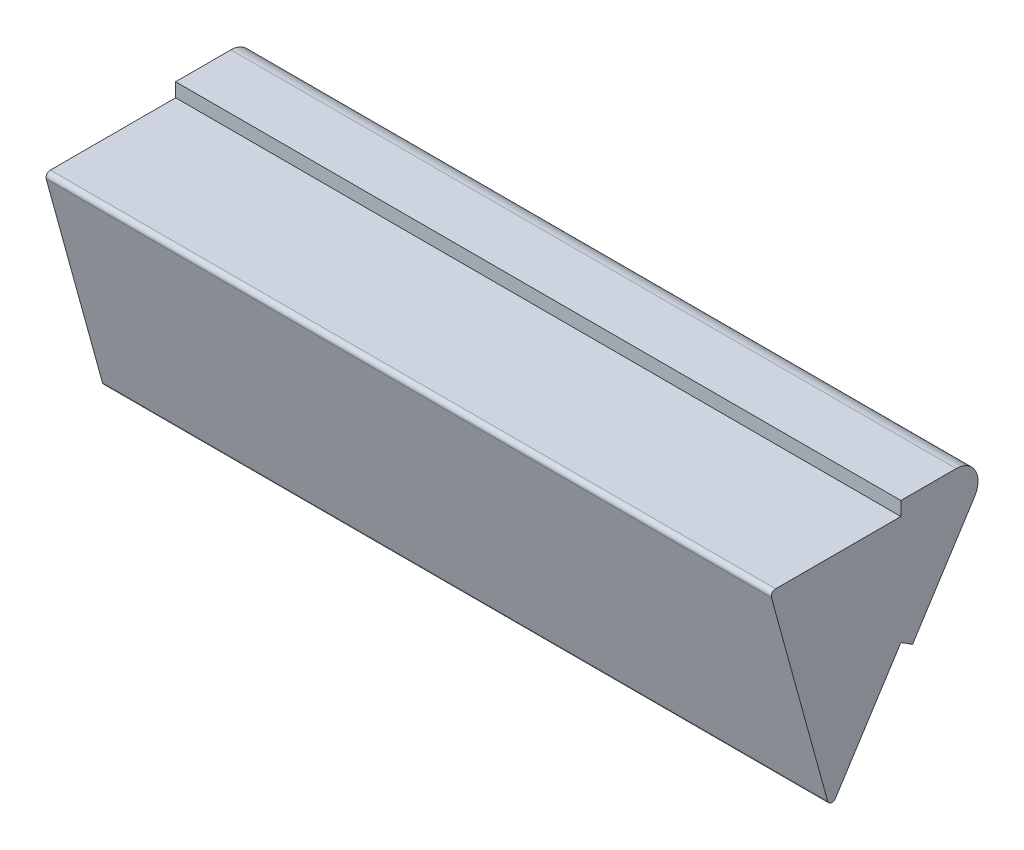
ISO-10303-21;
HEADER;
FILE_DESCRIPTION(('STEP AP214'),'2;1');
FILE_NAME('part.step','',(''),(''),'','','');
FILE_SCHEMA(('AUTOMOTIVE_DESIGN { 1 0 10303 214 1 1 1 1 }'));
ENDSEC;
DATA;
#1=APPLICATION_CONTEXT('core data for automotive mechanical design processes');
#2=APPLICATION_PROTOCOL_DEFINITION('international standard','automotive_design',2000,#1);
#3=PRODUCT_CONTEXT('',#1,'mechanical');
#4=PRODUCT('Part','Part','',(#3));
#5=PRODUCT_RELATED_PRODUCT_CATEGORY('part','',(#4));
#6=PRODUCT_DEFINITION_FORMATION('','',#4);
#7=PRODUCT_DEFINITION_CONTEXT('part definition',#1,'design');
#8=PRODUCT_DEFINITION('design','',#6,#7);
#9=PRODUCT_DEFINITION_SHAPE('','',#8);
#10=(LENGTH_UNIT() NAMED_UNIT(*) SI_UNIT(.MILLI.,.METRE.));
#11=(NAMED_UNIT(*) PLANE_ANGLE_UNIT() SI_UNIT($,.RADIAN.));
#12=(NAMED_UNIT(*) SI_UNIT($,.STERADIAN.) SOLID_ANGLE_UNIT());
#13=UNCERTAINTY_MEASURE_WITH_UNIT(LENGTH_MEASURE(1.E-05),#10,'distance_accuracy_value','');
#14=(GEOMETRIC_REPRESENTATION_CONTEXT(3) GLOBAL_UNCERTAINTY_ASSIGNED_CONTEXT((#13)) GLOBAL_UNIT_ASSIGNED_CONTEXT((#10,
#11,#12)) REPRESENTATION_CONTEXT('',''));
#15=CARTESIAN_POINT('',(0.,0.,0.));
#16=DIRECTION('',(0.,0.,1.));
#17=DIRECTION('',(1.,0.,0.));
#18=AXIS2_PLACEMENT_3D('',#15,#16,#17);
#19=CARTESIAN_POINT('',(166.124,-1.82499999999993,-42.6656532265789));
#20=DIRECTION('',(-1.,0.,0.));
#21=DIRECTION('',(0.,0.,1.));
#22=AXIS2_PLACEMENT_3D('',#19,#20,#21);
#23=CYLINDRICAL_SURFACE('',#22,5.);
#24=CARTESIAN_POINT('',(0.,-1.82499999999993,-42.6656532265789));
#25=DIRECTION('',(-1.,0.,0.));
#26=DIRECTION('',(0.,0.,1.));
#27=AXIS2_PLACEMENT_3D('',#24,#25,#26);
#28=CIRCLE('',#27,5.);
#29=CARTESIAN_POINT('',(0.,3.17500000000007,-42.6656532265788));
#30=VERTEX_POINT('',#29);
#31=CARTESIAN_POINT('',(0.,-4.52032411769741,-46.8769746225968));
#32=VERTEX_POINT('',#31);
#33=EDGE_CURVE('E145',#30,#32,#28,.T.);
#34=ORIENTED_EDGE('',*,*,#33,.F.);
#35=DIRECTION('',(-1.,0.,0.));
#36=VECTOR('',#35,1.);
#37=CARTESIAN_POINT('',(166.124,3.17500000000007,-42.6656532265788));
#38=LINE('',#37,#36);
#39=CARTESIAN_POINT('',(166.124,3.17500000000007,-42.6656532265788));
#40=VERTEX_POINT('',#39);
#41=EDGE_CURVE('E11',#40,#30,#38,.T.);
#42=ORIENTED_EDGE('',*,*,#41,.F.);
#43=CARTESIAN_POINT('',(166.124,-1.82499999999993,-42.6656532265789));
#44=DIRECTION('',(-1.,0.,0.));
#45=DIRECTION('',(0.,0.,1.));
#46=AXIS2_PLACEMENT_3D('',#43,#44,#45);
#47=CIRCLE('',#46,5.);
#48=CARTESIAN_POINT('',(166.124,-4.52032411769741,-46.8769746225968));
#49=VERTEX_POINT('',#48);
#50=EDGE_CURVE('E171',#40,#49,#47,.T.);
#51=ORIENTED_EDGE('',*,*,#50,.T.);
#52=DIRECTION('',(-1.,0.,0.));
#53=VECTOR('',#52,1.);
#54=CARTESIAN_POINT('',(166.124,-4.52032411769741,-46.8769746225968));
#55=LINE('',#54,#53);
#56=EDGE_CURVE('E39',#49,#32,#55,.T.);
#57=ORIENTED_EDGE('',*,*,#56,.T.);
#58=EDGE_LOOP('',(#34,#42,#51,#57));
#59=FACE_BOUND('',#58,.T.);
#60=ADVANCED_FACE('F36',(#59),#23,.T.);
#61=CARTESIAN_POINT('',(166.124,3.175,-30.));
#62=DIRECTION('',(0.,1.,0.));
#63=DIRECTION('',(0.,0.,1.));
#64=AXIS2_PLACEMENT_3D('',#61,#62,#63);
#65=PLANE('',#64);
#66=DIRECTION('',(0.,0.,-1.));
#67=VECTOR('',#66,1.);
#68=CARTESIAN_POINT('',(0.,3.175,-30.));
#69=LINE('',#68,#67);
#70=CARTESIAN_POINT('',(0.,3.175,-30.));
#71=VERTEX_POINT('',#70);
#72=EDGE_CURVE('E169',#71,#30,#69,.T.);
#73=ORIENTED_EDGE('',*,*,#72,.F.);
#74=DIRECTION('',(-1.,0.,0.));
#75=VECTOR('',#74,1.);
#76=CARTESIAN_POINT('',(166.124,3.175,-30.));
#77=LINE('',#76,#75);
#78=CARTESIAN_POINT('',(166.124,3.175,-30.));
#79=VERTEX_POINT('',#78);
#80=EDGE_CURVE('E45',#79,#71,#77,.T.);
#81=ORIENTED_EDGE('',*,*,#80,.F.);
#82=DIRECTION('',(0.,0.,-1.));
#83=VECTOR('',#82,1.);
#84=CARTESIAN_POINT('',(166.124,3.175,-30.));
#85=LINE('',#84,#83);
#86=EDGE_CURVE('E135',#79,#40,#85,.T.);
#87=ORIENTED_EDGE('',*,*,#86,.T.);
#88=ORIENTED_EDGE('',*,*,#41,.T.);
#89=EDGE_LOOP('',(#73,#81,#87,#88));
#90=FACE_BOUND('',#89,.T.);
#91=ADVANCED_FACE('F187',(#90),#65,.T.);
#92=CARTESIAN_POINT('',(166.124,0.,-30.));
#93=DIRECTION('',(0.,0.,1.));
#94=DIRECTION('',(1.,0.,0.));
#95=AXIS2_PLACEMENT_3D('',#92,#93,#94);
#96=PLANE('',#95);
#97=DIRECTION('',(0.,1.,0.));
#98=VECTOR('',#97,1.);
#99=CARTESIAN_POINT('',(0.,0.,-30.));
#100=LINE('',#99,#98);
#101=CARTESIAN_POINT('',(0.,0.,-30.));
#102=VERTEX_POINT('',#101);
#103=EDGE_CURVE('E122',#102,#71,#100,.T.);
#104=ORIENTED_EDGE('',*,*,#103,.F.);
#105=DIRECTION('',(-1.,0.,0.));
#106=VECTOR('',#105,1.);
#107=CARTESIAN_POINT('',(166.124,0.,-30.));
#108=LINE('',#107,#106);
#109=CARTESIAN_POINT('',(166.124,0.,-30.));
#110=VERTEX_POINT('',#109);
#111=EDGE_CURVE('E117',#110,#102,#108,.T.);
#112=ORIENTED_EDGE('',*,*,#111,.F.);
#113=DIRECTION('',(0.,1.,0.));
#114=VECTOR('',#113,1.);
#115=CARTESIAN_POINT('',(166.124,0.,-30.));
#116=LINE('',#115,#114);
#117=EDGE_CURVE('E120',#110,#79,#116,.T.);
#118=ORIENTED_EDGE('',*,*,#117,.T.);
#119=ORIENTED_EDGE('',*,*,#80,.T.);
#120=EDGE_LOOP('',(#104,#112,#118,#119));
#121=FACE_BOUND('',#120,.T.);
#122=ADVANCED_FACE('F119',(#121),#96,.T.);
#123=CARTESIAN_POINT('',(166.124,0.,-1.31223353994183));
#124=DIRECTION('',(0.,1.,0.));
#125=DIRECTION('',(0.,0.,1.));
#126=AXIS2_PLACEMENT_3D('',#123,#124,#125);
#127=PLANE('',#126);
#128=DIRECTION('',(0.,0.,-1.));
#129=VECTOR('',#128,1.);
#130=CARTESIAN_POINT('',(0.,0.,-1.31223353994183));
#131=LINE('',#130,#129);
#132=CARTESIAN_POINT('',(0.,0.,-1.31223353994183));
#133=VERTEX_POINT('',#132);
#134=EDGE_CURVE('E166',#133,#102,#131,.T.);
#135=ORIENTED_EDGE('',*,*,#134,.F.);
#136=DIRECTION('',(-1.,0.,0.));
#137=VECTOR('',#136,1.);
#138=CARTESIAN_POINT('',(166.124,0.,-1.31223353994183));
#139=LINE('',#138,#137);
#140=CARTESIAN_POINT('',(166.124,0.,-1.31223353994183));
#141=VERTEX_POINT('',#140);
#142=EDGE_CURVE('E127',#141,#133,#139,.T.);
#143=ORIENTED_EDGE('',*,*,#142,.F.);
#144=DIRECTION('',(0.,0.,-1.));
#145=VECTOR('',#144,1.);
#146=CARTESIAN_POINT('',(166.124,0.,-1.31223353994183));
#147=LINE('',#146,#145);
#148=EDGE_CURVE('E133',#141,#110,#147,.T.);
#149=ORIENTED_EDGE('',*,*,#148,.T.);
#150=ORIENTED_EDGE('',*,*,#111,.T.);
#151=EDGE_LOOP('',(#135,#143,#149,#150));
#152=FACE_BOUND('',#151,.T.);
#153=ADVANCED_FACE('F137',(#152),#127,.T.);
#154=CARTESIAN_POINT('',(166.124,-1.,-1.31223353994182));
#155=DIRECTION('',(-1.,0.,0.));
#156=DIRECTION('',(0.,0.,1.));
#157=AXIS2_PLACEMENT_3D('',#154,#155,#156);
#158=CYLINDRICAL_SURFACE('',#157,1.);
#159=CARTESIAN_POINT('',(0.,-1.,-1.31223353994182));
#160=DIRECTION('',(-1.,0.,0.));
#161=DIRECTION('',(0.,0.,1.));
#162=AXIS2_PLACEMENT_3D('',#159,#160,#161);
#163=CIRCLE('',#162,1.);
#164=CARTESIAN_POINT('',(0.,-1.26523449841163,-0.348049604765374));
#165=VERTEX_POINT('',#164);
#166=EDGE_CURVE('E163',#165,#133,#163,.T.);
#167=ORIENTED_EDGE('',*,*,#166,.F.);
#168=DIRECTION('',(-1.,0.,0.));
#169=VECTOR('',#168,1.);
#170=CARTESIAN_POINT('',(166.124,-1.26523449841163,-0.348049604765374));
#171=LINE('',#170,#169);
#172=CARTESIAN_POINT('',(166.124,-1.26523449841163,-0.348049604765374));
#173=VERTEX_POINT('',#172);
#174=EDGE_CURVE('E175',#173,#165,#171,.T.);
#175=ORIENTED_EDGE('',*,*,#174,.F.);
#176=CARTESIAN_POINT('',(166.124,-1.,-1.31223353994182));
#177=DIRECTION('',(-1.,0.,0.));
#178=DIRECTION('',(0.,0.,1.));
#179=AXIS2_PLACEMENT_3D('',#176,#177,#178);
#180=CIRCLE('',#179,1.);
#181=EDGE_CURVE('E138',#173,#141,#180,.T.);
#182=ORIENTED_EDGE('',*,*,#181,.T.);
#183=ORIENTED_EDGE('',*,*,#142,.T.);
#184=EDGE_LOOP('',(#167,#175,#182,#183));
#185=FACE_BOUND('',#184,.T.);
#186=ADVANCED_FACE('F200',(#185),#158,.T.);
#187=CARTESIAN_POINT('',(166.124,-48.1023809231914,-13.2323412692336));
#188=DIRECTION('',(0.,-0.265234498411619,0.964183935176446));
#189=DIRECTION('',(0.,-0.964183935176446,-0.265234498411619));
#190=AXIS2_PLACEMENT_3D('',#187,#188,#189);
#191=PLANE('',#190);
#192=DIRECTION('',(0.,0.964183935176446,0.265234498411619));
#193=VECTOR('',#192,1.);
#194=CARTESIAN_POINT('',(0.,-48.1023809231914,-13.2323412692336));
#195=LINE('',#194,#193);
#196=CARTESIAN_POINT('',(0.,-48.1023809231914,-13.2323412692336));
#197=VERTEX_POINT('',#196);
#198=EDGE_CURVE('E160',#197,#165,#195,.T.);
#199=ORIENTED_EDGE('',*,*,#198,.F.);
#200=DIRECTION('',(-1.,0.,0.));
#201=VECTOR('',#200,1.);
#202=CARTESIAN_POINT('',(166.124,-48.1023809231914,-13.2323412692336));
#203=LINE('',#202,#201);
#204=CARTESIAN_POINT('',(166.124,-48.1023809231914,-13.2323412692336));
#205=VERTEX_POINT('',#204);
#206=EDGE_CURVE('E177',#205,#197,#203,.T.);
#207=ORIENTED_EDGE('',*,*,#206,.F.);
#208=DIRECTION('',(0.,0.964183935176446,0.265234498411619));
#209=VECTOR('',#208,1.);
#210=CARTESIAN_POINT('',(166.124,-48.1023809231914,-13.2323412692336));
#211=LINE('',#210,#209);
#212=EDGE_CURVE('E140',#205,#173,#211,.T.);
#213=ORIENTED_EDGE('',*,*,#212,.T.);
#214=ORIENTED_EDGE('',*,*,#174,.T.);
#215=EDGE_LOOP('',(#199,#207,#213,#214));
#216=FACE_BOUND('',#215,.T.);
#217=ADVANCED_FACE('F203',(#216),#191,.T.);
#218=CARTESIAN_POINT('',(166.124,-47.8371464247798,-14.19652520441));
#219=DIRECTION('',(-1.,0.,0.));
#220=DIRECTION('',(0.,0.,1.));
#221=AXIS2_PLACEMENT_3D('',#218,#219,#220);
#222=CYLINDRICAL_SURFACE('',#221,1.);
#223=CARTESIAN_POINT('',(0.,-47.8371464247798,-14.19652520441));
#224=DIRECTION('',(-1.,0.,0.));
#225=DIRECTION('',(0.,0.,1.));
#226=AXIS2_PLACEMENT_3D('',#223,#224,#225);
#227=CIRCLE('',#226,1.);
#228=CARTESIAN_POINT('',(0.,-48.3762112483192,-15.0387894836136));
#229=VERTEX_POINT('',#228);
#230=EDGE_CURVE('E157',#229,#197,#227,.T.);
#231=ORIENTED_EDGE('',*,*,#230,.F.);
#232=DIRECTION('',(-1.,0.,0.));
#233=VECTOR('',#232,1.);
#234=CARTESIAN_POINT('',(166.124,-48.3762112483192,-15.0387894836136));
#235=LINE('',#234,#233);
#236=CARTESIAN_POINT('',(166.124,-48.3762112483192,-15.0387894836136));
#237=VERTEX_POINT('',#236);
#238=EDGE_CURVE('E179',#237,#229,#235,.T.);
#239=ORIENTED_EDGE('',*,*,#238,.F.);
#240=CARTESIAN_POINT('',(166.124,-47.8371464247798,-14.19652520441));
#241=DIRECTION('',(-1.,0.,0.));
#242=DIRECTION('',(0.,0.,1.));
#243=AXIS2_PLACEMENT_3D('',#240,#241,#242);
#244=CIRCLE('',#243,1.);
#245=EDGE_CURVE('E302',#237,#205,#244,.T.);
#246=ORIENTED_EDGE('',*,*,#245,.T.);
#247=ORIENTED_EDGE('',*,*,#206,.T.);
#248=EDGE_LOOP('',(#231,#239,#246,#247));
#249=FACE_BOUND('',#248,.T.);
#250=ADVANCED_FACE('F207',(#249),#222,.T.);
#251=CARTESIAN_POINT('',(166.124,-24.9999999999998,-29.9999999999996));
#252=DIRECTION('',(0.,-0.539064823539484,-0.842264279203591));
#253=DIRECTION('',(0.,0.842264279203591,-0.539064823539484));
#254=AXIS2_PLACEMENT_3D('',#251,#252,#253);
#255=PLANE('',#254);
#256=DIRECTION('',(0.,-0.842264279203591,0.539064823539484));
#257=VECTOR('',#256,1.);
#258=CARTESIAN_POINT('',(0.,-24.9999999999998,-29.9999999999996));
#259=LINE('',#258,#257);
#260=CARTESIAN_POINT('',(0.,-24.9999999999998,-29.9999999999996));
#261=VERTEX_POINT('',#260);
#262=EDGE_CURVE('E154',#261,#229,#259,.T.);
#263=ORIENTED_EDGE('',*,*,#262,.F.);
#264=DIRECTION('',(-1.,0.,0.));
#265=VECTOR('',#264,1.);
#266=CARTESIAN_POINT('',(166.124,-24.9999999999998,-29.9999999999996));
#267=LINE('',#266,#265);
#268=CARTESIAN_POINT('',(166.124,-24.9999999999998,-29.9999999999996));
#269=VERTEX_POINT('',#268);
#270=EDGE_CURVE('E181',#269,#261,#267,.T.);
#271=ORIENTED_EDGE('',*,*,#270,.F.);
#272=DIRECTION('',(0.,-0.842264279203591,0.539064823539484));
#273=VECTOR('',#272,1.);
#274=CARTESIAN_POINT('',(166.124,-24.9999999999998,-29.9999999999996));
#275=LINE('',#274,#273);
#276=EDGE_CURVE('E298',#269,#237,#275,.T.);
#277=ORIENTED_EDGE('',*,*,#276,.T.);
#278=ORIENTED_EDGE('',*,*,#238,.T.);
#279=EDGE_LOOP('',(#263,#271,#277,#278));
#280=FACE_BOUND('',#279,.T.);
#281=ADVANCED_FACE('F211',(#280),#255,.T.);
#282=CARTESIAN_POINT('',(166.124,-26.7115308147377,-32.674189086471));
#283=DIRECTION('',(0.,-0.842264279203591,0.539064823539485));
#284=DIRECTION('',(0.,-0.539064823539485,-0.842264279203591));
#285=AXIS2_PLACEMENT_3D('',#282,#283,#284);
#286=PLANE('',#285);
#287=DIRECTION('',(0.,0.539064823539485,0.842264279203591));
#288=VECTOR('',#287,1.);
#289=CARTESIAN_POINT('',(0.,-26.7115308147377,-32.674189086471));
#290=LINE('',#289,#288);
#291=CARTESIAN_POINT('',(0.,-26.7115308147377,-32.674189086471));
#292=VERTEX_POINT('',#291);
#293=EDGE_CURVE('E151',#292,#261,#290,.T.);
#294=ORIENTED_EDGE('',*,*,#293,.F.);
#295=DIRECTION('',(-1.,0.,0.));
#296=VECTOR('',#295,1.);
#297=CARTESIAN_POINT('',(166.124,-26.7115308147377,-32.674189086471));
#298=LINE('',#297,#296);
#299=CARTESIAN_POINT('',(166.124,-26.7115308147377,-32.674189086471));
#300=VERTEX_POINT('',#299);
#301=EDGE_CURVE('E182',#300,#292,#298,.T.);
#302=ORIENTED_EDGE('',*,*,#301,.F.);
#303=DIRECTION('',(0.,0.539064823539485,0.842264279203591));
#304=VECTOR('',#303,1.);
#305=CARTESIAN_POINT('',(166.124,-26.7115308147377,-32.674189086471));
#306=LINE('',#305,#304);
#307=EDGE_CURVE('E309',#300,#269,#306,.T.);
#308=ORIENTED_EDGE('',*,*,#307,.T.);
#309=ORIENTED_EDGE('',*,*,#270,.T.);
#310=EDGE_LOOP('',(#294,#302,#308,#309));
#311=FACE_BOUND('',#310,.T.);
#312=ADVANCED_FACE('F215',(#311),#286,.T.);
#313=CARTESIAN_POINT('',(166.124,-4.52032411769741,-46.8769746225968));
#314=DIRECTION('',(0.,-0.539064823539483,-0.842264279203592));
#315=DIRECTION('',(0.,0.842264279203592,-0.539064823539483));
#316=AXIS2_PLACEMENT_3D('',#313,#314,#315);
#317=PLANE('',#316);
#318=DIRECTION('',(0.,-0.842264279203592,0.539064823539483));
#319=VECTOR('',#318,1.);
#320=CARTESIAN_POINT('',(0.,-4.52032411769741,-46.8769746225968));
#321=LINE('',#320,#319);
#322=EDGE_CURVE('E148',#32,#292,#321,.T.);
#323=ORIENTED_EDGE('',*,*,#322,.F.);
#324=ORIENTED_EDGE('',*,*,#56,.F.);
#325=DIRECTION('',(0.,-0.842264279203592,0.539064823539483));
#326=VECTOR('',#325,1.);
#327=CARTESIAN_POINT('',(166.124,-4.52032411769741,-46.8769746225968));
#328=LINE('',#327,#326);
#329=EDGE_CURVE('E311',#49,#300,#328,.T.);
#330=ORIENTED_EDGE('',*,*,#329,.T.);
#331=ORIENTED_EDGE('',*,*,#301,.T.);
#332=EDGE_LOOP('',(#323,#324,#330,#331));
#333=FACE_BOUND('',#332,.T.);
#334=ADVANCED_FACE('F184',(#333),#317,.T.);
#335=CARTESIAN_POINT('',(166.124,-1.82499999999993,-42.6656532265789));
#336=DIRECTION('',(-1.,0.,0.));
#337=DIRECTION('',(0.,0.,1.));
#338=AXIS2_PLACEMENT_3D('',#335,#336,#337);
#339=PLANE('',#338);
#340=ORIENTED_EDGE('',*,*,#50,.F.);
#341=ORIENTED_EDGE('',*,*,#86,.F.);
#342=ORIENTED_EDGE('',*,*,#117,.F.);
#343=ORIENTED_EDGE('',*,*,#148,.F.);
#344=ORIENTED_EDGE('',*,*,#181,.F.);
#345=ORIENTED_EDGE('',*,*,#212,.F.);
#346=ORIENTED_EDGE('',*,*,#245,.F.);
#347=ORIENTED_EDGE('',*,*,#276,.F.);
#348=ORIENTED_EDGE('',*,*,#307,.F.);
#349=ORIENTED_EDGE('',*,*,#329,.F.);
#350=EDGE_LOOP('',(#340,#341,#342,#343,#344,#345,#346,#347,#348,#349));
#351=FACE_BOUND('',#350,.T.);
#352=ADVANCED_FACE('F131',(#351),#339,.F.);
#353=CARTESIAN_POINT('',(0.,-1.82499999999993,-42.6656532265789));
#354=DIRECTION('',(-1.,0.,0.));
#355=DIRECTION('',(0.,0.,1.));
#356=AXIS2_PLACEMENT_3D('',#353,#354,#355);
#357=PLANE('',#356);
#358=ORIENTED_EDGE('',*,*,#33,.T.);
#359=ORIENTED_EDGE('',*,*,#322,.T.);
#360=ORIENTED_EDGE('',*,*,#293,.T.);
#361=ORIENTED_EDGE('',*,*,#262,.T.);
#362=ORIENTED_EDGE('',*,*,#230,.T.);
#363=ORIENTED_EDGE('',*,*,#198,.T.);
#364=ORIENTED_EDGE('',*,*,#166,.T.);
#365=ORIENTED_EDGE('',*,*,#134,.T.);
#366=ORIENTED_EDGE('',*,*,#103,.T.);
#367=ORIENTED_EDGE('',*,*,#72,.T.);
#368=EDGE_LOOP('',(#358,#359,#360,#361,#362,#363,#364,#365,#366,#367));
#369=FACE_BOUND('',#368,.T.);
#370=ADVANCED_FACE('F186',(#369),#357,.T.);
#371=CLOSED_SHELL('',(#60,#91,#122,#153,#186,#217,#250,#281,#312,#334,#352,#370));
#372=MANIFOLD_SOLID_BREP('B2',#371);
#373=ADVANCED_BREP_SHAPE_REPRESENTATION('',(#18,#372),#14);
#374=SHAPE_DEFINITION_REPRESENTATION(#9,#373);
ENDSEC;
END-ISO-10303-21;
